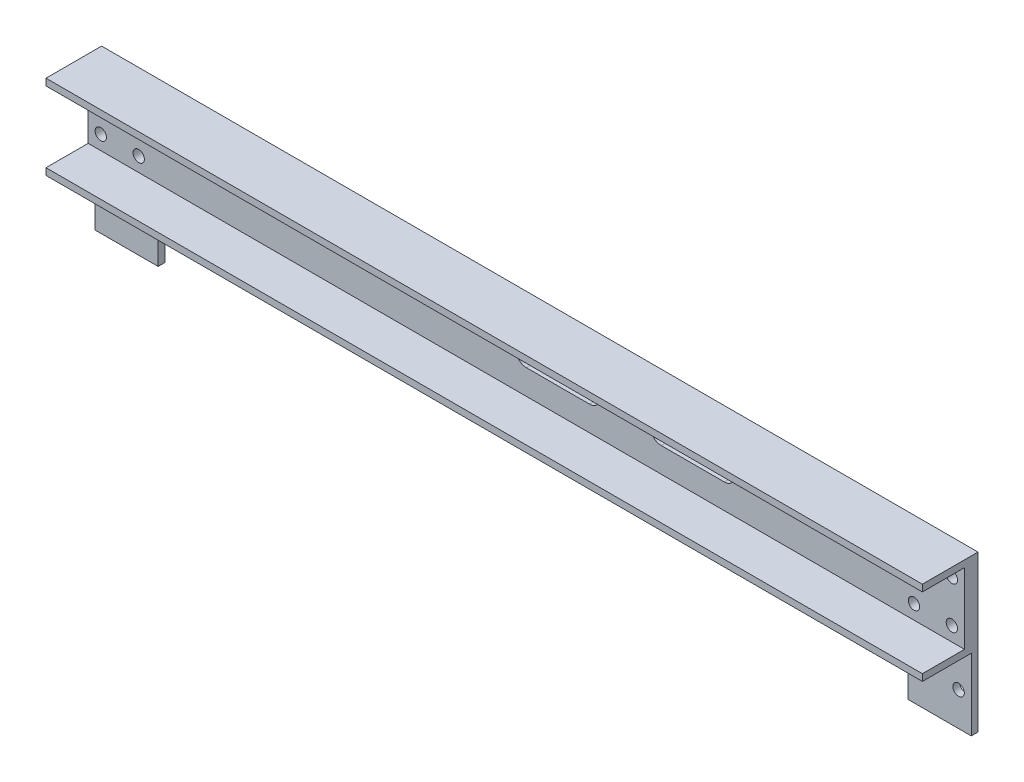
ISO-10303-21;
HEADER;
FILE_DESCRIPTION(('STEP AP214'),'2;1');
FILE_NAME('part.step','',(''),(''),'','','');
FILE_SCHEMA(('AUTOMOTIVE_DESIGN { 1 0 10303 214 1 1 1 1 }'));
ENDSEC;
DATA;
#1=APPLICATION_CONTEXT('core data for automotive mechanical design processes');
#2=APPLICATION_PROTOCOL_DEFINITION('international standard','automotive_design',2000,#1);
#3=PRODUCT_CONTEXT('',#1,'mechanical');
#4=PRODUCT('Part','Part','',(#3));
#5=PRODUCT_RELATED_PRODUCT_CATEGORY('part','',(#4));
#6=PRODUCT_DEFINITION_FORMATION('','',#4);
#7=PRODUCT_DEFINITION_CONTEXT('part definition',#1,'design');
#8=PRODUCT_DEFINITION('design','',#6,#7);
#9=PRODUCT_DEFINITION_SHAPE('','',#8);
#10=(LENGTH_UNIT() NAMED_UNIT(*) SI_UNIT(.MILLI.,.METRE.));
#11=(NAMED_UNIT(*) PLANE_ANGLE_UNIT() SI_UNIT($,.RADIAN.));
#12=(NAMED_UNIT(*) SI_UNIT($,.STERADIAN.) SOLID_ANGLE_UNIT());
#13=UNCERTAINTY_MEASURE_WITH_UNIT(LENGTH_MEASURE(1.E-05),#10,'distance_accuracy_value','');
#14=(GEOMETRIC_REPRESENTATION_CONTEXT(3) GLOBAL_UNCERTAINTY_ASSIGNED_CONTEXT((#13)) GLOBAL_UNIT_ASSIGNED_CONTEXT((#10,
#11,#12)) REPRESENTATION_CONTEXT('',''));
#15=CARTESIAN_POINT('',(0.,0.,0.));
#16=DIRECTION('',(0.,0.,1.));
#17=DIRECTION('',(1.,0.,0.));
#18=AXIS2_PLACEMENT_3D('',#15,#16,#17);
#19=CARTESIAN_POINT('',(0.,0.,16.));
#20=DIRECTION('',(0.,0.,-1.));
#21=DIRECTION('',(-1.,0.,0.));
#22=AXIS2_PLACEMENT_3D('',#19,#20,#21);
#23=PLANE('',#22);
#24=CARTESIAN_POINT('',(-505.,-25.,16.));
#25=DIRECTION('',(0.,0.,1.));
#26=DIRECTION('',(1.,0.,0.));
#27=AXIS2_PLACEMENT_3D('',#24,#25,#26);
#28=CIRCLE('',#27,6.74999999999998);
#29=CARTESIAN_POINT('',(-498.25,-25.,16.));
#30=VERTEX_POINT('',#29);
#31=EDGE_CURVE('E819',#30,#30,#28,.T.);
#32=ORIENTED_EDGE('',*,*,#31,.F.);
#33=EDGE_LOOP('',(#32));
#34=FACE_BOUND('',#33,.T.);
#35=CARTESIAN_POINT('',(-460.,-25.,16.));
#36=DIRECTION('',(0.,0.,1.));
#37=DIRECTION('',(1.,0.,0.));
#38=AXIS2_PLACEMENT_3D('',#35,#36,#37);
#39=CIRCLE('',#38,6.74999999999998);
#40=CARTESIAN_POINT('',(-453.25,-25.,16.));
#41=VERTEX_POINT('',#40);
#42=EDGE_CURVE('E827',#41,#41,#39,.T.);
#43=ORIENTED_EDGE('',*,*,#42,.F.);
#44=EDGE_LOOP('',(#43));
#45=FACE_BOUND('',#44,.T.);
#46=DIRECTION('',(-1.,0.,0.));
#47=VECTOR('',#46,1.);
#48=CARTESIAN_POINT('',(0.,-12.5,16.));
#49=LINE('',#48,#47);
#50=CARTESIAN_POINT('',(75.,-12.5,16.));
#51=VERTEX_POINT('',#50);
#52=CARTESIAN_POINT('',(0.,-12.5,16.));
#53=VERTEX_POINT('',#52);
#54=EDGE_CURVE('E421',#51,#53,#49,.T.);
#55=ORIENTED_EDGE('',*,*,#54,.T.);
#56=CARTESIAN_POINT('',(0.,0.,16.));
#57=DIRECTION('',(0.,0.,1.));
#58=DIRECTION('',(1.,0.,0.));
#59=AXIS2_PLACEMENT_3D('',#56,#57,#58);
#60=CIRCLE('',#59,12.5);
#61=CARTESIAN_POINT('',(0.,12.5,16.));
#62=VERTEX_POINT('',#61);
#63=EDGE_CURVE('E11',#53,#62,#60,.F.);
#64=ORIENTED_EDGE('',*,*,#63,.T.);
#65=DIRECTION('',(-1.,0.,0.));
#66=VECTOR('',#65,1.);
#67=CARTESIAN_POINT('',(0.,12.5,16.));
#68=LINE('',#67,#66);
#69=CARTESIAN_POINT('',(75.,12.5,16.));
#70=VERTEX_POINT('',#69);
#71=EDGE_CURVE('E48',#62,#70,#68,.F.);
#72=ORIENTED_EDGE('',*,*,#71,.T.);
#73=CARTESIAN_POINT('',(75.,0.,16.));
#74=DIRECTION('',(0.,0.,1.));
#75=DIRECTION('',(1.,0.,0.));
#76=AXIS2_PLACEMENT_3D('',#73,#74,#75);
#77=CIRCLE('',#76,12.5);
#78=EDGE_CURVE('E425',#70,#51,#77,.F.);
#79=ORIENTED_EDGE('',*,*,#78,.T.);
#80=EDGE_LOOP('',(#55,#64,#72,#79));
#81=FACE_BOUND('',#80,.T.);
#82=DIRECTION('',(-1.,0.,0.));
#83=VECTOR('',#82,1.);
#84=CARTESIAN_POINT('',(0.,-12.5,16.));
#85=LINE('',#84,#83);
#86=CARTESIAN_POINT('',(235.,-12.5,16.));
#87=VERTEX_POINT('',#86);
#88=CARTESIAN_POINT('',(160.,-12.5,16.));
#89=VERTEX_POINT('',#88);
#90=EDGE_CURVE('E405',#87,#89,#85,.T.);
#91=ORIENTED_EDGE('',*,*,#90,.T.);
#92=CARTESIAN_POINT('',(160.,0.,16.));
#93=DIRECTION('',(0.,0.,1.));
#94=DIRECTION('',(1.,0.,0.));
#95=AXIS2_PLACEMENT_3D('',#92,#93,#94);
#96=CIRCLE('',#95,12.5);
#97=CARTESIAN_POINT('',(160.,12.5,16.));
#98=VERTEX_POINT('',#97);
#99=EDGE_CURVE('E417',#89,#98,#96,.F.);
#100=ORIENTED_EDGE('',*,*,#99,.T.);
#101=DIRECTION('',(-1.,0.,0.));
#102=VECTOR('',#101,1.);
#103=CARTESIAN_POINT('',(0.,12.5,16.));
#104=LINE('',#103,#102);
#105=CARTESIAN_POINT('',(235.,12.5,16.));
#106=VERTEX_POINT('',#105);
#107=EDGE_CURVE('E413',#98,#106,#104,.F.);
#108=ORIENTED_EDGE('',*,*,#107,.T.);
#109=CARTESIAN_POINT('',(235.,0.,16.));
#110=DIRECTION('',(0.,0.,1.));
#111=DIRECTION('',(1.,0.,0.));
#112=AXIS2_PLACEMENT_3D('',#109,#110,#111);
#113=CIRCLE('',#112,12.5);
#114=EDGE_CURVE('E409',#106,#87,#113,.F.);
#115=ORIENTED_EDGE('',*,*,#114,.T.);
#116=EDGE_LOOP('',(#91,#100,#108,#115));
#117=FACE_BOUND('',#116,.T.);
#118=DIRECTION('',(1.,0.,0.));
#119=VECTOR('',#118,1.);
#120=CARTESIAN_POINT('',(520.,42.,16.));
#121=LINE('',#120,#119);
#122=CARTESIAN_POINT('',(-520.,42.,16.));
#123=VERTEX_POINT('',#122);
#124=CARTESIAN_POINT('',(520.,42.,16.));
#125=VERTEX_POINT('',#124);
#126=EDGE_CURVE('E55',#123,#125,#121,.T.);
#127=ORIENTED_EDGE('',*,*,#126,.F.);
#128=DIRECTION('',(0.,-1.,0.));
#129=VECTOR('',#128,1.);
#130=CARTESIAN_POINT('',(-520.,-50.,16.));
#131=LINE('',#130,#129);
#132=CARTESIAN_POINT('',(-520.,-42.,16.));
#133=VERTEX_POINT('',#132);
#134=EDGE_CURVE('E323',#123,#133,#131,.T.);
#135=ORIENTED_EDGE('',*,*,#134,.T.);
#136=DIRECTION('',(-1.,0.,0.));
#137=VECTOR('',#136,1.);
#138=CARTESIAN_POINT('',(-520.,-42.,16.));
#139=LINE('',#138,#137);
#140=CARTESIAN_POINT('',(520.,-42.,16.));
#141=VERTEX_POINT('',#140);
#142=EDGE_CURVE('E232',#141,#133,#139,.T.);
#143=ORIENTED_EDGE('',*,*,#142,.F.);
#144=DIRECTION('',(0.,1.,0.));
#145=VECTOR('',#144,1.);
#146=CARTESIAN_POINT('',(520.,-50.,16.));
#147=LINE('',#146,#145);
#148=EDGE_CURVE('E60',#141,#125,#147,.T.);
#149=ORIENTED_EDGE('',*,*,#148,.T.);
#150=EDGE_LOOP('',(#127,#135,#143,#149));
#151=FACE_BOUND('',#150,.T.);
#152=CARTESIAN_POINT('',(505.,25.,16.));
#153=DIRECTION('',(0.,0.,1.));
#154=DIRECTION('',(1.,0.,0.));
#155=AXIS2_PLACEMENT_3D('',#152,#153,#154);
#156=CIRCLE('',#155,6.75000000000003);
#157=CARTESIAN_POINT('',(511.75,25.,16.));
#158=VERTEX_POINT('',#157);
#159=EDGE_CURVE('E886',#158,#158,#156,.T.);
#160=ORIENTED_EDGE('',*,*,#159,.F.);
#161=EDGE_LOOP('',(#160));
#162=FACE_BOUND('',#161,.T.);
#163=CARTESIAN_POINT('',(460.,25.,16.));
#164=DIRECTION('',(0.,0.,1.));
#165=DIRECTION('',(1.,0.,0.));
#166=AXIS2_PLACEMENT_3D('',#163,#164,#165);
#167=CIRCLE('',#166,6.74999999999998);
#168=CARTESIAN_POINT('',(466.75,25.,16.));
#169=VERTEX_POINT('',#168);
#170=EDGE_CURVE('E879',#169,#169,#167,.T.);
#171=ORIENTED_EDGE('',*,*,#170,.F.);
#172=EDGE_LOOP('',(#171));
#173=FACE_BOUND('',#172,.T.);
#174=CARTESIAN_POINT('',(460.,-25.,16.));
#175=DIRECTION('',(0.,0.,1.));
#176=DIRECTION('',(1.,0.,0.));
#177=AXIS2_PLACEMENT_3D('',#174,#175,#176);
#178=CIRCLE('',#177,6.74999999999998);
#179=CARTESIAN_POINT('',(466.75,-25.,16.));
#180=VERTEX_POINT('',#179);
#181=EDGE_CURVE('E871',#180,#180,#178,.T.);
#182=ORIENTED_EDGE('',*,*,#181,.F.);
#183=EDGE_LOOP('',(#182));
#184=FACE_BOUND('',#183,.T.);
#185=CARTESIAN_POINT('',(505.,-25.,16.));
#186=DIRECTION('',(0.,0.,1.));
#187=DIRECTION('',(1.,0.,0.));
#188=AXIS2_PLACEMENT_3D('',#185,#186,#187);
#189=CIRCLE('',#188,6.75000000000003);
#190=CARTESIAN_POINT('',(511.75,-25.,16.));
#191=VERTEX_POINT('',#190);
#192=EDGE_CURVE('E863',#191,#191,#189,.T.);
#193=ORIENTED_EDGE('',*,*,#192,.F.);
#194=EDGE_LOOP('',(#193));
#195=FACE_BOUND('',#194,.T.);
#196=CARTESIAN_POINT('',(-505.,25.,16.));
#197=DIRECTION('',(0.,0.,1.));
#198=DIRECTION('',(1.,0.,0.));
#199=AXIS2_PLACEMENT_3D('',#196,#197,#198);
#200=CIRCLE('',#199,6.74999999999998);
#201=CARTESIAN_POINT('',(-498.25,25.,16.));
#202=VERTEX_POINT('',#201);
#203=EDGE_CURVE('E807',#202,#202,#200,.T.);
#204=ORIENTED_EDGE('',*,*,#203,.F.);
#205=EDGE_LOOP('',(#204));
#206=FACE_BOUND('',#205,.T.);
#207=CARTESIAN_POINT('',(-460.,25.,16.));
#208=DIRECTION('',(0.,0.,1.));
#209=DIRECTION('',(1.,0.,0.));
#210=AXIS2_PLACEMENT_3D('',#207,#208,#209);
#211=CIRCLE('',#210,6.74999999999998);
#212=CARTESIAN_POINT('',(-453.25,25.,16.));
#213=VERTEX_POINT('',#212);
#214=EDGE_CURVE('E802',#213,#213,#211,.T.);
#215=ORIENTED_EDGE('',*,*,#214,.F.);
#216=EDGE_LOOP('',(#215));
#217=FACE_BOUND('',#216,.T.);
#218=ADVANCED_FACE('F39',(#34,#45,#81,#117,#151,#162,#173,#184,#195,#206,#217),#23,.F.);
#219=CARTESIAN_POINT('',(0.,0.,8.));
#220=DIRECTION('',(0.,0.,-1.));
#221=DIRECTION('',(-1.,0.,0.));
#222=AXIS2_PLACEMENT_3D('',#219,#220,#221);
#223=PLANE('',#222);
#224=CARTESIAN_POINT('',(-460.,-95.,8.));
#225=DIRECTION('',(0.,0.,-1.));
#226=DIRECTION('',(-1.,0.,0.));
#227=AXIS2_PLACEMENT_3D('',#224,#225,#226);
#228=CIRCLE('',#227,6.74999999999998);
#229=CARTESIAN_POINT('',(-466.75,-95.,8.));
#230=VERTEX_POINT('',#229);
#231=EDGE_CURVE('E839',#230,#230,#228,.T.);
#232=ORIENTED_EDGE('',*,*,#231,.T.);
#233=EDGE_LOOP('',(#232));
#234=FACE_BOUND('',#233,.T.);
#235=CARTESIAN_POINT('',(-505.,-95.,8.));
#236=DIRECTION('',(0.,0.,-1.));
#237=DIRECTION('',(-1.,0.,0.));
#238=AXIS2_PLACEMENT_3D('',#235,#236,#237);
#239=CIRCLE('',#238,6.74999999999998);
#240=CARTESIAN_POINT('',(-511.75,-95.,8.));
#241=VERTEX_POINT('',#240);
#242=EDGE_CURVE('E847',#241,#241,#239,.T.);
#243=ORIENTED_EDGE('',*,*,#242,.T.);
#244=EDGE_LOOP('',(#243));
#245=FACE_BOUND('',#244,.T.);
#246=DIRECTION('',(1.,0.,0.));
#247=VECTOR('',#246,1.);
#248=CARTESIAN_POINT('',(-520.,-50.,8.));
#249=LINE('',#248,#247);
#250=CARTESIAN_POINT('',(-520.,-50.,8.));
#251=VERTEX_POINT('',#250);
#252=CARTESIAN_POINT('',(-445.,-50.,8.));
#253=VERTEX_POINT('',#252);
#254=EDGE_CURVE('E286',#251,#253,#249,.T.);
#255=ORIENTED_EDGE('',*,*,#254,.F.);
#256=DIRECTION('',(0.,-1.,0.));
#257=VECTOR('',#256,1.);
#258=CARTESIAN_POINT('',(-520.,-50.,8.));
#259=LINE('',#258,#257);
#260=CARTESIAN_POINT('',(-520.,-135.,8.));
#261=VERTEX_POINT('',#260);
#262=EDGE_CURVE('E341',#251,#261,#259,.T.);
#263=ORIENTED_EDGE('',*,*,#262,.T.);
#264=DIRECTION('',(1.,0.,0.));
#265=VECTOR('',#264,1.);
#266=CARTESIAN_POINT('',(-520.,-135.,8.));
#267=LINE('',#266,#265);
#268=CARTESIAN_POINT('',(-445.,-135.,8.));
#269=VERTEX_POINT('',#268);
#270=EDGE_CURVE('E345',#261,#269,#267,.T.);
#271=ORIENTED_EDGE('',*,*,#270,.T.);
#272=DIRECTION('',(0.,1.,0.));
#273=VECTOR('',#272,1.);
#274=CARTESIAN_POINT('',(-445.,-50.,8.));
#275=LINE('',#274,#273);
#276=EDGE_CURVE('E348',#269,#253,#275,.T.);
#277=ORIENTED_EDGE('',*,*,#276,.T.);
#278=EDGE_LOOP('',(#255,#263,#271,#277));
#279=FACE_BOUND('',#278,.T.);
#280=ADVANCED_FACE('F461',(#234,#245,#279),#223,.F.);
#281=CARTESIAN_POINT('',(460.,-95.,8.));
#282=DIRECTION('',(0.,0.,-1.));
#283=DIRECTION('',(-1.,0.,0.));
#284=AXIS2_PLACEMENT_3D('',#281,#282,#283);
#285=CIRCLE('',#284,6.74999999999998);
#286=CARTESIAN_POINT('',(453.25,-95.,8.));
#287=VERTEX_POINT('',#286);
#288=EDGE_CURVE('E515',#287,#287,#285,.T.);
#289=ORIENTED_EDGE('',*,*,#288,.T.);
#290=EDGE_LOOP('',(#289));
#291=FACE_BOUND('',#290,.T.);
#292=CARTESIAN_POINT('',(505.,-95.,8.));
#293=DIRECTION('',(0.,0.,-1.));
#294=DIRECTION('',(-1.,0.,0.));
#295=AXIS2_PLACEMENT_3D('',#292,#293,#294);
#296=CIRCLE('',#295,6.75000000000003);
#297=CARTESIAN_POINT('',(498.25,-95.,8.));
#298=VERTEX_POINT('',#297);
#299=EDGE_CURVE('E519',#298,#298,#296,.T.);
#300=ORIENTED_EDGE('',*,*,#299,.T.);
#301=EDGE_LOOP('',(#300));
#302=FACE_BOUND('',#301,.T.);
#303=CARTESIAN_POINT('',(445.,-50.,8.));
#304=VERTEX_POINT('',#303);
#305=CARTESIAN_POINT('',(520.,-50.,8.));
#306=VERTEX_POINT('',#305);
#307=EDGE_CURVE('E330',#304,#306,#249,.T.);
#308=ORIENTED_EDGE('',*,*,#307,.F.);
#309=DIRECTION('',(0.,-1.,0.));
#310=VECTOR('',#309,1.);
#311=CARTESIAN_POINT('',(445.,-50.,8.));
#312=LINE('',#311,#310);
#313=CARTESIAN_POINT('',(445.,-135.,8.));
#314=VERTEX_POINT('',#313);
#315=EDGE_CURVE('E351',#304,#314,#312,.T.);
#316=ORIENTED_EDGE('',*,*,#315,.T.);
#317=DIRECTION('',(1.,0.,0.));
#318=VECTOR('',#317,1.);
#319=CARTESIAN_POINT('',(520.,-135.,8.));
#320=LINE('',#319,#318);
#321=CARTESIAN_POINT('',(520.,-135.,8.));
#322=VERTEX_POINT('',#321);
#323=EDGE_CURVE('E354',#314,#322,#320,.T.);
#324=ORIENTED_EDGE('',*,*,#323,.T.);
#325=DIRECTION('',(0.,1.,0.));
#326=VECTOR('',#325,1.);
#327=CARTESIAN_POINT('',(520.,-50.,8.));
#328=LINE('',#327,#326);
#329=EDGE_CURVE('E338',#322,#306,#328,.T.);
#330=ORIENTED_EDGE('',*,*,#329,.T.);
#331=EDGE_LOOP('',(#308,#316,#324,#330));
#332=FACE_BOUND('',#331,.T.);
#333=ADVANCED_FACE('F467',(#291,#302,#332),#223,.F.);
#334=CARTESIAN_POINT('',(-520.,50.,8.));
#335=DIRECTION('',(0.,-1.,0.));
#336=DIRECTION('',(0.,0.,-1.));
#337=AXIS2_PLACEMENT_3D('',#334,#335,#336);
#338=PLANE('',#337);
#339=DIRECTION('',(-1.,0.,0.));
#340=VECTOR('',#339,1.);
#341=CARTESIAN_POINT('',(-520.,50.,0.));
#342=LINE('',#341,#340);
#343=CARTESIAN_POINT('',(520.,50.,0.));
#344=VERTEX_POINT('',#343);
#345=CARTESIAN_POINT('',(-520.,50.,0.));
#346=VERTEX_POINT('',#345);
#347=EDGE_CURVE('E194',#344,#346,#342,.T.);
#348=ORIENTED_EDGE('',*,*,#347,.T.);
#349=DIRECTION('',(0.,0.,-1.));
#350=VECTOR('',#349,1.);
#351=CARTESIAN_POINT('',(-520.,50.,8.));
#352=LINE('',#351,#350);
#353=CARTESIAN_POINT('',(-520.,50.,66.));
#354=VERTEX_POINT('',#353);
#355=EDGE_CURVE('E188',#354,#346,#352,.T.);
#356=ORIENTED_EDGE('',*,*,#355,.F.);
#357=DIRECTION('',(-1.,0.,0.));
#358=VECTOR('',#357,1.);
#359=CARTESIAN_POINT('',(520.,50.,66.));
#360=LINE('',#359,#358);
#361=CARTESIAN_POINT('',(520.,50.,66.));
#362=VERTEX_POINT('',#361);
#363=EDGE_CURVE('E192',#362,#354,#360,.T.);
#364=ORIENTED_EDGE('',*,*,#363,.F.);
#365=DIRECTION('',(0.,0.,-1.));
#366=VECTOR('',#365,1.);
#367=CARTESIAN_POINT('',(520.,50.,8.));
#368=LINE('',#367,#366);
#369=EDGE_CURVE('E197',#362,#344,#368,.T.);
#370=ORIENTED_EDGE('',*,*,#369,.T.);
#371=EDGE_LOOP('',(#348,#356,#364,#370));
#372=FACE_BOUND('',#371,.T.);
#373=ADVANCED_FACE('F41',(#372),#338,.F.);
#374=CARTESIAN_POINT('',(-520.,-50.,8.));
#375=DIRECTION('',(1.,0.,0.));
#376=DIRECTION('',(0.,0.,-1.));
#377=AXIS2_PLACEMENT_3D('',#374,#375,#376);
#378=PLANE('',#377);
#379=DIRECTION('',(0.,-1.,0.));
#380=VECTOR('',#379,1.);
#381=CARTESIAN_POINT('',(-520.,-50.,0.));
#382=LINE('',#381,#380);
#383=CARTESIAN_POINT('',(-520.,-135.,0.));
#384=VERTEX_POINT('',#383);
#385=EDGE_CURVE('E361',#346,#384,#382,.T.);
#386=ORIENTED_EDGE('',*,*,#385,.T.);
#387=DIRECTION('',(0.,0.,-1.));
#388=VECTOR('',#387,1.);
#389=CARTESIAN_POINT('',(-520.,-135.,8.));
#390=LINE('',#389,#388);
#391=EDGE_CURVE('E198',#261,#384,#390,.T.);
#392=ORIENTED_EDGE('',*,*,#391,.F.);
#393=ORIENTED_EDGE('',*,*,#262,.F.);
#394=DIRECTION('',(0.,0.,-1.));
#395=VECTOR('',#394,1.);
#396=CARTESIAN_POINT('',(-520.,-50.,16.));
#397=LINE('',#396,#395);
#398=CARTESIAN_POINT('',(-520.,-50.,66.));
#399=VERTEX_POINT('',#398);
#400=EDGE_CURVE('E334',#399,#251,#397,.T.);
#401=ORIENTED_EDGE('',*,*,#400,.F.);
#402=DIRECTION('',(0.,-1.,0.));
#403=VECTOR('',#402,1.);
#404=CARTESIAN_POINT('',(-520.,-42.,66.));
#405=LINE('',#404,#403);
#406=CARTESIAN_POINT('',(-520.,-42.,66.));
#407=VERTEX_POINT('',#406);
#408=EDGE_CURVE('E243',#407,#399,#405,.T.);
#409=ORIENTED_EDGE('',*,*,#408,.F.);
#410=DIRECTION('',(0.,0.,-1.));
#411=VECTOR('',#410,1.);
#412=CARTESIAN_POINT('',(-520.,-42.,66.));
#413=LINE('',#412,#411);
#414=EDGE_CURVE('E247',#407,#133,#413,.T.);
#415=ORIENTED_EDGE('',*,*,#414,.T.);
#416=ORIENTED_EDGE('',*,*,#134,.F.);
#417=DIRECTION('',(0.,0.,-1.));
#418=VECTOR('',#417,1.);
#419=CARTESIAN_POINT('',(-520.,42.,66.));
#420=LINE('',#419,#418);
#421=CARTESIAN_POINT('',(-520.,42.,66.));
#422=VERTEX_POINT('',#421);
#423=EDGE_CURVE('E204',#422,#123,#420,.T.);
#424=ORIENTED_EDGE('',*,*,#423,.F.);
#425=DIRECTION('',(0.,-1.,0.));
#426=VECTOR('',#425,1.);
#427=CARTESIAN_POINT('',(-520.,50.,66.));
#428=LINE('',#427,#426);
#429=EDGE_CURVE('E201',#354,#422,#428,.T.);
#430=ORIENTED_EDGE('',*,*,#429,.F.);
#431=ORIENTED_EDGE('',*,*,#355,.T.);
#432=EDGE_LOOP('',(#386,#392,#393,#401,#409,#415,#416,#424,#430,#431));
#433=FACE_BOUND('',#432,.T.);
#434=ADVANCED_FACE('F202',(#433),#378,.F.);
#435=CARTESIAN_POINT('',(-520.,-135.,8.));
#436=DIRECTION('',(0.,1.,0.));
#437=DIRECTION('',(0.,0.,1.));
#438=AXIS2_PLACEMENT_3D('',#435,#436,#437);
#439=PLANE('',#438);
#440=DIRECTION('',(1.,0.,0.));
#441=VECTOR('',#440,1.);
#442=CARTESIAN_POINT('',(-520.,-135.,0.));
#443=LINE('',#442,#441);
#444=CARTESIAN_POINT('',(-445.,-135.,0.));
#445=VERTEX_POINT('',#444);
#446=EDGE_CURVE('E364',#384,#445,#443,.T.);
#447=ORIENTED_EDGE('',*,*,#446,.T.);
#448=DIRECTION('',(0.,0.,-1.));
#449=VECTOR('',#448,1.);
#450=CARTESIAN_POINT('',(-445.,-135.,8.));
#451=LINE('',#450,#449);
#452=EDGE_CURVE('E396',#269,#445,#451,.T.);
#453=ORIENTED_EDGE('',*,*,#452,.F.);
#454=ORIENTED_EDGE('',*,*,#270,.F.);
#455=ORIENTED_EDGE('',*,*,#391,.T.);
#456=EDGE_LOOP('',(#447,#453,#454,#455));
#457=FACE_BOUND('',#456,.T.);
#458=ADVANCED_FACE('F498',(#457),#439,.F.);
#459=CARTESIAN_POINT('',(-445.,-50.,8.));
#460=DIRECTION('',(-1.,0.,0.));
#461=DIRECTION('',(0.,0.,1.));
#462=AXIS2_PLACEMENT_3D('',#459,#460,#461);
#463=PLANE('',#462);
#464=DIRECTION('',(0.,1.,0.));
#465=VECTOR('',#464,1.);
#466=CARTESIAN_POINT('',(-445.,-50.,0.));
#467=LINE('',#466,#465);
#468=CARTESIAN_POINT('',(-445.,-50.,0.));
#469=VERTEX_POINT('',#468);
#470=EDGE_CURVE('E367',#445,#469,#467,.T.);
#471=ORIENTED_EDGE('',*,*,#470,.T.);
#472=DIRECTION('',(0.,0.,-1.));
#473=VECTOR('',#472,1.);
#474=CARTESIAN_POINT('',(-445.,-50.,8.));
#475=LINE('',#474,#473);
#476=EDGE_CURVE('E392',#253,#469,#475,.T.);
#477=ORIENTED_EDGE('',*,*,#476,.F.);
#478=ORIENTED_EDGE('',*,*,#276,.F.);
#479=ORIENTED_EDGE('',*,*,#452,.T.);
#480=EDGE_LOOP('',(#471,#477,#478,#479));
#481=FACE_BOUND('',#480,.T.);
#482=ADVANCED_FACE('F494',(#481),#463,.F.);
#483=CARTESIAN_POINT('',(-445.,-50.,8.));
#484=DIRECTION('',(0.,1.,0.));
#485=DIRECTION('',(-1.,0.,0.));
#486=AXIS2_PLACEMENT_3D('',#483,#484,#485);
#487=PLANE('',#486);
#488=DIRECTION('',(1.,0.,0.));
#489=VECTOR('',#488,1.);
#490=CARTESIAN_POINT('',(-445.,-50.,0.));
#491=LINE('',#490,#489);
#492=CARTESIAN_POINT('',(445.,-50.,0.));
#493=VERTEX_POINT('',#492);
#494=EDGE_CURVE('E370',#469,#493,#491,.T.);
#495=ORIENTED_EDGE('',*,*,#494,.T.);
#496=DIRECTION('',(0.,0.,-1.));
#497=VECTOR('',#496,1.);
#498=CARTESIAN_POINT('',(445.,-50.,8.));
#499=LINE('',#498,#497);
#500=EDGE_CURVE('E388',#304,#493,#499,.T.);
#501=ORIENTED_EDGE('',*,*,#500,.F.);
#502=ORIENTED_EDGE('',*,*,#307,.T.);
#503=DIRECTION('',(0.,0.,-1.));
#504=VECTOR('',#503,1.);
#505=CARTESIAN_POINT('',(520.,-50.,16.));
#506=LINE('',#505,#504);
#507=CARTESIAN_POINT('',(520.,-50.,66.));
#508=VERTEX_POINT('',#507);
#509=EDGE_CURVE('E326',#508,#306,#506,.T.);
#510=ORIENTED_EDGE('',*,*,#509,.F.);
#511=DIRECTION('',(1.,0.,0.));
#512=VECTOR('',#511,1.);
#513=CARTESIAN_POINT('',(-520.,-50.,66.));
#514=LINE('',#513,#512);
#515=EDGE_CURVE('E233',#399,#508,#514,.T.);
#516=ORIENTED_EDGE('',*,*,#515,.F.);
#517=ORIENTED_EDGE('',*,*,#400,.T.);
#518=ORIENTED_EDGE('',*,*,#254,.T.);
#519=ORIENTED_EDGE('',*,*,#476,.T.);
#520=EDGE_LOOP('',(#495,#501,#502,#510,#516,#517,#518,#519));
#521=FACE_BOUND('',#520,.T.);
#522=ADVANCED_FACE('F490',(#521),#487,.F.);
#523=CARTESIAN_POINT('',(445.,-50.,8.));
#524=DIRECTION('',(1.,0.,0.));
#525=DIRECTION('',(0.,0.,-1.));
#526=AXIS2_PLACEMENT_3D('',#523,#524,#525);
#527=PLANE('',#526);
#528=DIRECTION('',(0.,-1.,0.));
#529=VECTOR('',#528,1.);
#530=CARTESIAN_POINT('',(445.,-50.,0.));
#531=LINE('',#530,#529);
#532=CARTESIAN_POINT('',(445.,-135.,0.));
#533=VERTEX_POINT('',#532);
#534=EDGE_CURVE('E373',#493,#533,#531,.T.);
#535=ORIENTED_EDGE('',*,*,#534,.T.);
#536=DIRECTION('',(0.,0.,-1.));
#537=VECTOR('',#536,1.);
#538=CARTESIAN_POINT('',(445.,-135.,8.));
#539=LINE('',#538,#537);
#540=EDGE_CURVE('E384',#314,#533,#539,.T.);
#541=ORIENTED_EDGE('',*,*,#540,.F.);
#542=ORIENTED_EDGE('',*,*,#315,.F.);
#543=ORIENTED_EDGE('',*,*,#500,.T.);
#544=EDGE_LOOP('',(#535,#541,#542,#543));
#545=FACE_BOUND('',#544,.T.);
#546=ADVANCED_FACE('F486',(#545),#527,.F.);
#547=CARTESIAN_POINT('',(520.,-135.,8.));
#548=DIRECTION('',(0.,1.,0.));
#549=DIRECTION('',(-1.,0.,0.));
#550=AXIS2_PLACEMENT_3D('',#547,#548,#549);
#551=PLANE('',#550);
#552=DIRECTION('',(1.,0.,0.));
#553=VECTOR('',#552,1.);
#554=CARTESIAN_POINT('',(520.,-135.,0.));
#555=LINE('',#554,#553);
#556=CARTESIAN_POINT('',(520.,-135.,0.));
#557=VERTEX_POINT('',#556);
#558=EDGE_CURVE('E376',#533,#557,#555,.T.);
#559=ORIENTED_EDGE('',*,*,#558,.T.);
#560=DIRECTION('',(0.,0.,-1.));
#561=VECTOR('',#560,1.);
#562=CARTESIAN_POINT('',(520.,-135.,8.));
#563=LINE('',#562,#561);
#564=EDGE_CURVE('E358',#322,#557,#563,.T.);
#565=ORIENTED_EDGE('',*,*,#564,.F.);
#566=ORIENTED_EDGE('',*,*,#323,.F.);
#567=ORIENTED_EDGE('',*,*,#540,.T.);
#568=EDGE_LOOP('',(#559,#565,#566,#567));
#569=FACE_BOUND('',#568,.T.);
#570=ADVANCED_FACE('F482',(#569),#551,.F.);
#571=CARTESIAN_POINT('',(520.,-50.,8.));
#572=DIRECTION('',(-1.,0.,0.));
#573=DIRECTION('',(0.,0.,1.));
#574=AXIS2_PLACEMENT_3D('',#571,#572,#573);
#575=PLANE('',#574);
#576=DIRECTION('',(0.,1.,0.));
#577=VECTOR('',#576,1.);
#578=CARTESIAN_POINT('',(520.,-50.,0.));
#579=LINE('',#578,#577);
#580=EDGE_CURVE('E342',#557,#344,#579,.T.);
#581=ORIENTED_EDGE('',*,*,#580,.T.);
#582=ORIENTED_EDGE('',*,*,#369,.F.);
#583=DIRECTION('',(0.,1.,0.));
#584=VECTOR('',#583,1.);
#585=CARTESIAN_POINT('',(520.,42.,66.));
#586=LINE('',#585,#584);
#587=CARTESIAN_POINT('',(520.,42.,66.));
#588=VERTEX_POINT('',#587);
#589=EDGE_CURVE('E213',#588,#362,#586,.T.);
#590=ORIENTED_EDGE('',*,*,#589,.F.);
#591=DIRECTION('',(0.,0.,-1.));
#592=VECTOR('',#591,1.);
#593=CARTESIAN_POINT('',(520.,42.,66.));
#594=LINE('',#593,#592);
#595=EDGE_CURVE('E225',#588,#125,#594,.T.);
#596=ORIENTED_EDGE('',*,*,#595,.T.);
#597=ORIENTED_EDGE('',*,*,#148,.F.);
#598=DIRECTION('',(0.,0.,-1.));
#599=VECTOR('',#598,1.);
#600=CARTESIAN_POINT('',(520.,-42.,66.));
#601=LINE('',#600,#599);
#602=CARTESIAN_POINT('',(520.,-42.,66.));
#603=VERTEX_POINT('',#602);
#604=EDGE_CURVE('E254',#603,#141,#601,.T.);
#605=ORIENTED_EDGE('',*,*,#604,.F.);
#606=DIRECTION('',(0.,1.,0.));
#607=VECTOR('',#606,1.);
#608=CARTESIAN_POINT('',(520.,-50.,66.));
#609=LINE('',#608,#607);
#610=EDGE_CURVE('E237',#508,#603,#609,.T.);
#611=ORIENTED_EDGE('',*,*,#610,.F.);
#612=ORIENTED_EDGE('',*,*,#509,.T.);
#613=ORIENTED_EDGE('',*,*,#329,.F.);
#614=ORIENTED_EDGE('',*,*,#564,.T.);
#615=EDGE_LOOP('',(#581,#582,#590,#596,#597,#605,#611,#612,#613,#614));
#616=FACE_BOUND('',#615,.T.);
#617=ADVANCED_FACE('F478',(#616),#575,.F.);
#618=CARTESIAN_POINT('',(0.,0.,0.));
#619=DIRECTION('',(0.,0.,-1.));
#620=DIRECTION('',(-1.,0.,0.));
#621=AXIS2_PLACEMENT_3D('',#618,#619,#620);
#622=PLANE('',#621);
#623=CARTESIAN_POINT('',(-460.,25.,0.));
#624=DIRECTION('',(0.,0.,-1.));
#625=DIRECTION('',(-1.,0.,0.));
#626=AXIS2_PLACEMENT_3D('',#623,#624,#625);
#627=CIRCLE('',#626,6.74999999999998);
#628=CARTESIAN_POINT('',(-466.75,25.,0.));
#629=VERTEX_POINT('',#628);
#630=EDGE_CURVE('E805',#629,#629,#627,.T.);
#631=ORIENTED_EDGE('',*,*,#630,.F.);
#632=EDGE_LOOP('',(#631));
#633=FACE_BOUND('',#632,.T.);
#634=CARTESIAN_POINT('',(-505.,25.,0.));
#635=DIRECTION('',(0.,0.,-1.));
#636=DIRECTION('',(-1.,0.,0.));
#637=AXIS2_PLACEMENT_3D('',#634,#635,#636);
#638=CIRCLE('',#637,6.74999999999998);
#639=CARTESIAN_POINT('',(-511.75,25.,0.));
#640=VERTEX_POINT('',#639);
#641=EDGE_CURVE('E812',#640,#640,#638,.T.);
#642=ORIENTED_EDGE('',*,*,#641,.F.);
#643=EDGE_LOOP('',(#642));
#644=FACE_BOUND('',#643,.T.);
#645=CARTESIAN_POINT('',(-505.,-25.,0.));
#646=DIRECTION('',(0.,0.,-1.));
#647=DIRECTION('',(-1.,0.,0.));
#648=AXIS2_PLACEMENT_3D('',#645,#646,#647);
#649=CIRCLE('',#648,6.74999999999998);
#650=CARTESIAN_POINT('',(-511.75,-25.,0.));
#651=VERTEX_POINT('',#650);
#652=EDGE_CURVE('E823',#651,#651,#649,.T.);
#653=ORIENTED_EDGE('',*,*,#652,.F.);
#654=EDGE_LOOP('',(#653));
#655=FACE_BOUND('',#654,.T.);
#656=CARTESIAN_POINT('',(-460.,-25.,0.));
#657=DIRECTION('',(0.,0.,-1.));
#658=DIRECTION('',(-1.,0.,0.));
#659=AXIS2_PLACEMENT_3D('',#656,#657,#658);
#660=CIRCLE('',#659,6.74999999999998);
#661=CARTESIAN_POINT('',(-466.75,-25.,0.));
#662=VERTEX_POINT('',#661);
#663=EDGE_CURVE('E831',#662,#662,#660,.T.);
#664=ORIENTED_EDGE('',*,*,#663,.F.);
#665=EDGE_LOOP('',(#664));
#666=FACE_BOUND('',#665,.T.);
#667=CARTESIAN_POINT('',(-460.,-95.,0.));
#668=DIRECTION('',(0.,0.,-1.));
#669=DIRECTION('',(-1.,0.,0.));
#670=AXIS2_PLACEMENT_3D('',#667,#668,#669);
#671=CIRCLE('',#670,6.74999999999998);
#672=CARTESIAN_POINT('',(-466.75,-95.,0.));
#673=VERTEX_POINT('',#672);
#674=EDGE_CURVE('E835',#673,#673,#671,.T.);
#675=ORIENTED_EDGE('',*,*,#674,.F.);
#676=EDGE_LOOP('',(#675));
#677=FACE_BOUND('',#676,.T.);
#678=CARTESIAN_POINT('',(-505.,-95.,0.));
#679=DIRECTION('',(0.,0.,-1.));
#680=DIRECTION('',(-1.,0.,0.));
#681=AXIS2_PLACEMENT_3D('',#678,#679,#680);
#682=CIRCLE('',#681,6.74999999999998);
#683=CARTESIAN_POINT('',(-511.75,-95.,0.));
#684=VERTEX_POINT('',#683);
#685=EDGE_CURVE('E843',#684,#684,#682,.T.);
#686=ORIENTED_EDGE('',*,*,#685,.F.);
#687=EDGE_LOOP('',(#686));
#688=FACE_BOUND('',#687,.T.);
#689=CARTESIAN_POINT('',(460.,-95.,0.));
#690=DIRECTION('',(0.,0.,-1.));
#691=DIRECTION('',(-1.,0.,0.));
#692=AXIS2_PLACEMENT_3D('',#689,#690,#691);
#693=CIRCLE('',#692,6.74999999999998);
#694=CARTESIAN_POINT('',(453.25,-95.,0.));
#695=VERTEX_POINT('',#694);
#696=EDGE_CURVE('E851',#695,#695,#693,.T.);
#697=ORIENTED_EDGE('',*,*,#696,.F.);
#698=EDGE_LOOP('',(#697));
#699=FACE_BOUND('',#698,.T.);
#700=CARTESIAN_POINT('',(505.,-95.,0.));
#701=DIRECTION('',(0.,0.,-1.));
#702=DIRECTION('',(-1.,0.,0.));
#703=AXIS2_PLACEMENT_3D('',#700,#701,#702);
#704=CIRCLE('',#703,6.75000000000003);
#705=CARTESIAN_POINT('',(498.25,-95.,0.));
#706=VERTEX_POINT('',#705);
#707=EDGE_CURVE('E857',#706,#706,#704,.T.);
#708=ORIENTED_EDGE('',*,*,#707,.F.);
#709=EDGE_LOOP('',(#708));
#710=FACE_BOUND('',#709,.T.);
#711=CARTESIAN_POINT('',(505.,-25.,0.));
#712=DIRECTION('',(0.,0.,-1.));
#713=DIRECTION('',(-1.,0.,0.));
#714=AXIS2_PLACEMENT_3D('',#711,#712,#713);
#715=CIRCLE('',#714,6.75000000000003);
#716=CARTESIAN_POINT('',(498.25,-25.,0.));
#717=VERTEX_POINT('',#716);
#718=EDGE_CURVE('E867',#717,#717,#715,.T.);
#719=ORIENTED_EDGE('',*,*,#718,.F.);
#720=EDGE_LOOP('',(#719));
#721=FACE_BOUND('',#720,.T.);
#722=CARTESIAN_POINT('',(460.,-25.,0.));
#723=DIRECTION('',(0.,0.,-1.));
#724=DIRECTION('',(-1.,0.,0.));
#725=AXIS2_PLACEMENT_3D('',#722,#723,#724);
#726=CIRCLE('',#725,6.74999999999998);
#727=CARTESIAN_POINT('',(453.25,-25.,0.));
#728=VERTEX_POINT('',#727);
#729=EDGE_CURVE('E875',#728,#728,#726,.T.);
#730=ORIENTED_EDGE('',*,*,#729,.F.);
#731=EDGE_LOOP('',(#730));
#732=FACE_BOUND('',#731,.T.);
#733=CARTESIAN_POINT('',(460.,25.,0.));
#734=DIRECTION('',(0.,0.,-1.));
#735=DIRECTION('',(-1.,0.,0.));
#736=AXIS2_PLACEMENT_3D('',#733,#734,#735);
#737=CIRCLE('',#736,6.74999999999998);
#738=CARTESIAN_POINT('',(453.25,25.,0.));
#739=VERTEX_POINT('',#738);
#740=EDGE_CURVE('E883',#739,#739,#737,.T.);
#741=ORIENTED_EDGE('',*,*,#740,.F.);
#742=EDGE_LOOP('',(#741));
#743=FACE_BOUND('',#742,.T.);
#744=CARTESIAN_POINT('',(505.,25.,0.));
#745=DIRECTION('',(0.,0.,-1.));
#746=DIRECTION('',(-1.,0.,0.));
#747=AXIS2_PLACEMENT_3D('',#744,#745,#746);
#748=CIRCLE('',#747,6.75000000000003);
#749=CARTESIAN_POINT('',(498.25,25.,0.));
#750=VERTEX_POINT('',#749);
#751=EDGE_CURVE('E217',#750,#750,#748,.T.);
#752=ORIENTED_EDGE('',*,*,#751,.F.);
#753=EDGE_LOOP('',(#752));
#754=FACE_BOUND('',#753,.T.);
#755=CARTESIAN_POINT('',(0.,0.,0.));
#756=DIRECTION('',(0.,0.,1.));
#757=DIRECTION('',(1.,0.,0.));
#758=AXIS2_PLACEMENT_3D('',#755,#756,#757);
#759=CIRCLE('',#758,12.5);
#760=CARTESIAN_POINT('',(0.,12.5,0.));
#761=VERTEX_POINT('',#760);
#762=CARTESIAN_POINT('',(0.,-12.5,0.));
#763=VERTEX_POINT('',#762);
#764=EDGE_CURVE('E259',#761,#763,#759,.T.);
#765=ORIENTED_EDGE('',*,*,#764,.T.);
#766=DIRECTION('',(1.,0.,0.));
#767=VECTOR('',#766,1.);
#768=CARTESIAN_POINT('',(0.,-12.5,0.));
#769=LINE('',#768,#767);
#770=CARTESIAN_POINT('',(75.,-12.5,0.));
#771=VERTEX_POINT('',#770);
#772=EDGE_CURVE('E263',#763,#771,#769,.T.);
#773=ORIENTED_EDGE('',*,*,#772,.T.);
#774=CARTESIAN_POINT('',(75.,0.,0.));
#775=DIRECTION('',(0.,0.,1.));
#776=DIRECTION('',(1.,0.,0.));
#777=AXIS2_PLACEMENT_3D('',#774,#775,#776);
#778=CIRCLE('',#777,12.5);
#779=CARTESIAN_POINT('',(75.,12.5,0.));
#780=VERTEX_POINT('',#779);
#781=EDGE_CURVE('E268',#771,#780,#778,.T.);
#782=ORIENTED_EDGE('',*,*,#781,.T.);
#783=DIRECTION('',(-1.,0.,0.));
#784=VECTOR('',#783,1.);
#785=CARTESIAN_POINT('',(0.,12.5,0.));
#786=LINE('',#785,#784);
#787=EDGE_CURVE('E272',#780,#761,#786,.T.);
#788=ORIENTED_EDGE('',*,*,#787,.T.);
#789=EDGE_LOOP('',(#765,#773,#782,#788));
#790=FACE_BOUND('',#789,.T.);
#791=CARTESIAN_POINT('',(160.,0.,0.));
#792=DIRECTION('',(0.,0.,1.));
#793=DIRECTION('',(1.,0.,0.));
#794=AXIS2_PLACEMENT_3D('',#791,#792,#793);
#795=CIRCLE('',#794,12.5);
#796=CARTESIAN_POINT('',(160.,12.5,0.));
#797=VERTEX_POINT('',#796);
#798=CARTESIAN_POINT('',(160.,-12.5,0.));
#799=VERTEX_POINT('',#798);
#800=EDGE_CURVE('E258',#797,#799,#795,.T.);
#801=ORIENTED_EDGE('',*,*,#800,.T.);
#802=DIRECTION('',(1.,0.,0.));
#803=VECTOR('',#802,1.);
#804=CARTESIAN_POINT('',(160.,-12.5,0.));
#805=LINE('',#804,#803);
#806=CARTESIAN_POINT('',(235.,-12.5,0.));
#807=VERTEX_POINT('',#806);
#808=EDGE_CURVE('E295',#799,#807,#805,.T.);
#809=ORIENTED_EDGE('',*,*,#808,.T.);
#810=CARTESIAN_POINT('',(235.,0.,0.));
#811=DIRECTION('',(0.,0.,1.));
#812=DIRECTION('',(1.,0.,0.));
#813=AXIS2_PLACEMENT_3D('',#810,#811,#812);
#814=CIRCLE('',#813,12.5);
#815=CARTESIAN_POINT('',(235.,12.5,0.));
#816=VERTEX_POINT('',#815);
#817=EDGE_CURVE('E299',#807,#816,#814,.T.);
#818=ORIENTED_EDGE('',*,*,#817,.T.);
#819=DIRECTION('',(-1.,0.,0.));
#820=VECTOR('',#819,1.);
#821=CARTESIAN_POINT('',(160.,12.5,0.));
#822=LINE('',#821,#820);
#823=EDGE_CURVE('E303',#816,#797,#822,.T.);
#824=ORIENTED_EDGE('',*,*,#823,.T.);
#825=EDGE_LOOP('',(#801,#809,#818,#824));
#826=FACE_BOUND('',#825,.T.);
#827=ORIENTED_EDGE('',*,*,#347,.F.);
#828=ORIENTED_EDGE('',*,*,#580,.F.);
#829=ORIENTED_EDGE('',*,*,#558,.F.);
#830=ORIENTED_EDGE('',*,*,#534,.F.);
#831=ORIENTED_EDGE('',*,*,#494,.F.);
#832=ORIENTED_EDGE('',*,*,#470,.F.);
#833=ORIENTED_EDGE('',*,*,#446,.F.);
#834=ORIENTED_EDGE('',*,*,#385,.F.);
#835=EDGE_LOOP('',(#827,#828,#829,#830,#831,#832,#833,#834));
#836=FACE_BOUND('',#835,.T.);
#837=ADVANCED_FACE('F441',(#633,#644,#655,#666,#677,#688,#699,#710,#721,#732,#743,#754,#790,
#826,#836),#622,.T.);
#838=CARTESIAN_POINT('',(160.,0.,0.));
#839=DIRECTION('',(0.,0.,1.));
#840=DIRECTION('',(1.,0.,0.));
#841=AXIS2_PLACEMENT_3D('',#838,#839,#840);
#842=CYLINDRICAL_SURFACE('',#841,12.5);
#843=DIRECTION('',(0.,0.,1.));
#844=VECTOR('',#843,1.);
#845=CARTESIAN_POINT('',(160.,-12.5,0.));
#846=LINE('',#845,#844);
#847=EDGE_CURVE('E307',#799,#89,#846,.T.);
#848=ORIENTED_EDGE('',*,*,#847,.F.);
#849=ORIENTED_EDGE('',*,*,#800,.F.);
#850=DIRECTION('',(0.,0.,1.));
#851=VECTOR('',#850,1.);
#852=CARTESIAN_POINT('',(160.,12.5,0.));
#853=LINE('',#852,#851);
#854=EDGE_CURVE('E264',#797,#98,#853,.T.);
#855=ORIENTED_EDGE('',*,*,#854,.T.);
#856=ORIENTED_EDGE('',*,*,#99,.F.);
#857=EDGE_LOOP('',(#848,#849,#855,#856));
#858=FACE_BOUND('',#857,.T.);
#859=ADVANCED_FACE('F473',(#858),#842,.F.);
#860=CARTESIAN_POINT('',(160.,12.5,0.));
#861=DIRECTION('',(0.,1.,0.));
#862=DIRECTION('',(-1.,0.,0.));
#863=AXIS2_PLACEMENT_3D('',#860,#861,#862);
#864=PLANE('',#863);
#865=ORIENTED_EDGE('',*,*,#854,.F.);
#866=ORIENTED_EDGE('',*,*,#823,.F.);
#867=DIRECTION('',(0.,0.,1.));
#868=VECTOR('',#867,1.);
#869=CARTESIAN_POINT('',(235.,12.5,0.));
#870=LINE('',#869,#868);
#871=EDGE_CURVE('E308',#816,#106,#870,.T.);
#872=ORIENTED_EDGE('',*,*,#871,.T.);
#873=ORIENTED_EDGE('',*,*,#107,.F.);
#874=EDGE_LOOP('',(#865,#866,#872,#873));
#875=FACE_BOUND('',#874,.T.);
#876=ADVANCED_FACE('F560',(#875),#864,.F.);
#877=CARTESIAN_POINT('',(235.,0.,0.));
#878=DIRECTION('',(0.,0.,1.));
#879=DIRECTION('',(1.,0.,0.));
#880=AXIS2_PLACEMENT_3D('',#877,#878,#879);
#881=CYLINDRICAL_SURFACE('',#880,12.5);
#882=ORIENTED_EDGE('',*,*,#871,.F.);
#883=ORIENTED_EDGE('',*,*,#817,.F.);
#884=DIRECTION('',(0.,0.,1.));
#885=VECTOR('',#884,1.);
#886=CARTESIAN_POINT('',(235.,-12.5,0.));
#887=LINE('',#886,#885);
#888=EDGE_CURVE('E312',#807,#87,#887,.T.);
#889=ORIENTED_EDGE('',*,*,#888,.T.);
#890=ORIENTED_EDGE('',*,*,#114,.F.);
#891=EDGE_LOOP('',(#882,#883,#889,#890));
#892=FACE_BOUND('',#891,.T.);
#893=ADVANCED_FACE('F557',(#892),#881,.F.);
#894=CARTESIAN_POINT('',(160.,-12.5,0.));
#895=DIRECTION('',(0.,-1.,0.));
#896=DIRECTION('',(1.,0.,0.));
#897=AXIS2_PLACEMENT_3D('',#894,#895,#896);
#898=PLANE('',#897);
#899=ORIENTED_EDGE('',*,*,#888,.F.);
#900=ORIENTED_EDGE('',*,*,#808,.F.);
#901=ORIENTED_EDGE('',*,*,#847,.T.);
#902=ORIENTED_EDGE('',*,*,#90,.F.);
#903=EDGE_LOOP('',(#899,#900,#901,#902));
#904=FACE_BOUND('',#903,.T.);
#905=ADVANCED_FACE('F553',(#904),#898,.F.);
#906=CARTESIAN_POINT('',(0.,0.,0.));
#907=DIRECTION('',(0.,0.,1.));
#908=DIRECTION('',(1.,0.,0.));
#909=AXIS2_PLACEMENT_3D('',#906,#907,#908);
#910=CYLINDRICAL_SURFACE('',#909,12.5);
#911=DIRECTION('',(0.,0.,1.));
#912=VECTOR('',#911,1.);
#913=CARTESIAN_POINT('',(0.,-12.5,0.));
#914=LINE('',#913,#912);
#915=EDGE_CURVE('E276',#763,#53,#914,.T.);
#916=ORIENTED_EDGE('',*,*,#915,.F.);
#917=ORIENTED_EDGE('',*,*,#764,.F.);
#918=DIRECTION('',(0.,0.,1.));
#919=VECTOR('',#918,1.);
#920=CARTESIAN_POINT('',(0.,12.5,0.));
#921=LINE('',#920,#919);
#922=EDGE_CURVE('E281',#761,#62,#921,.T.);
#923=ORIENTED_EDGE('',*,*,#922,.T.);
#924=ORIENTED_EDGE('',*,*,#63,.F.);
#925=EDGE_LOOP('',(#916,#917,#923,#924));
#926=FACE_BOUND('',#925,.T.);
#927=ADVANCED_FACE('F438',(#926),#910,.F.);
#928=CARTESIAN_POINT('',(0.,12.5,0.));
#929=DIRECTION('',(0.,1.,0.));
#930=DIRECTION('',(-1.,0.,0.));
#931=AXIS2_PLACEMENT_3D('',#928,#929,#930);
#932=PLANE('',#931);
#933=ORIENTED_EDGE('',*,*,#922,.F.);
#934=ORIENTED_EDGE('',*,*,#787,.F.);
#935=DIRECTION('',(0.,0.,1.));
#936=VECTOR('',#935,1.);
#937=CARTESIAN_POINT('',(75.,12.5,0.));
#938=LINE('',#937,#936);
#939=EDGE_CURVE('E277',#780,#70,#938,.T.);
#940=ORIENTED_EDGE('',*,*,#939,.T.);
#941=ORIENTED_EDGE('',*,*,#71,.F.);
#942=EDGE_LOOP('',(#933,#934,#940,#941));
#943=FACE_BOUND('',#942,.T.);
#944=ADVANCED_FACE('F434',(#943),#932,.F.);
#945=CARTESIAN_POINT('',(75.,0.,0.));
#946=DIRECTION('',(0.,0.,1.));
#947=DIRECTION('',(1.,0.,0.));
#948=AXIS2_PLACEMENT_3D('',#945,#946,#947);
#949=CYLINDRICAL_SURFACE('',#948,12.5);
#950=ORIENTED_EDGE('',*,*,#939,.F.);
#951=ORIENTED_EDGE('',*,*,#781,.F.);
#952=DIRECTION('',(0.,0.,1.));
#953=VECTOR('',#952,1.);
#954=CARTESIAN_POINT('',(75.,-12.5,0.));
#955=LINE('',#954,#953);
#956=EDGE_CURVE('E282',#771,#51,#955,.T.);
#957=ORIENTED_EDGE('',*,*,#956,.T.);
#958=ORIENTED_EDGE('',*,*,#78,.F.);
#959=EDGE_LOOP('',(#950,#951,#957,#958));
#960=FACE_BOUND('',#959,.T.);
#961=ADVANCED_FACE('F445',(#960),#949,.F.);
#962=CARTESIAN_POINT('',(0.,-12.5,0.));
#963=DIRECTION('',(0.,-1.,0.));
#964=DIRECTION('',(1.,0.,0.));
#965=AXIS2_PLACEMENT_3D('',#962,#963,#964);
#966=PLANE('',#965);
#967=ORIENTED_EDGE('',*,*,#956,.F.);
#968=ORIENTED_EDGE('',*,*,#772,.F.);
#969=ORIENTED_EDGE('',*,*,#915,.T.);
#970=ORIENTED_EDGE('',*,*,#54,.F.);
#971=EDGE_LOOP('',(#967,#968,#969,#970));
#972=FACE_BOUND('',#971,.T.);
#973=ADVANCED_FACE('F447',(#972),#966,.F.);
#974=CARTESIAN_POINT('',(-520.,-42.,66.));
#975=DIRECTION('',(0.,-1.,0.));
#976=DIRECTION('',(0.,0.,-1.));
#977=AXIS2_PLACEMENT_3D('',#974,#975,#976);
#978=PLANE('',#977);
#979=ORIENTED_EDGE('',*,*,#142,.T.);
#980=ORIENTED_EDGE('',*,*,#414,.F.);
#981=DIRECTION('',(-1.,0.,0.));
#982=VECTOR('',#981,1.);
#983=CARTESIAN_POINT('',(-520.,-42.,66.));
#984=LINE('',#983,#982);
#985=EDGE_CURVE('E240',#603,#407,#984,.T.);
#986=ORIENTED_EDGE('',*,*,#985,.F.);
#987=ORIENTED_EDGE('',*,*,#604,.T.);
#988=EDGE_LOOP('',(#979,#980,#986,#987));
#989=FACE_BOUND('',#988,.T.);
#990=ADVANCED_FACE('F449',(#989),#978,.F.);
#991=CARTESIAN_POINT('',(0.,0.,66.));
#992=DIRECTION('',(0.,0.,1.));
#993=DIRECTION('',(1.,0.,0.));
#994=AXIS2_PLACEMENT_3D('',#991,#992,#993);
#995=PLANE('',#994);
#996=ORIENTED_EDGE('',*,*,#515,.T.);
#997=ORIENTED_EDGE('',*,*,#610,.T.);
#998=ORIENTED_EDGE('',*,*,#985,.T.);
#999=ORIENTED_EDGE('',*,*,#408,.T.);
#1000=EDGE_LOOP('',(#996,#997,#998,#999));
#1001=FACE_BOUND('',#1000,.T.);
#1002=ADVANCED_FACE('F455',(#1001),#995,.T.);
#1003=CARTESIAN_POINT('',(520.,42.,66.));
#1004=DIRECTION('',(0.,1.,0.));
#1005=DIRECTION('',(0.,0.,1.));
#1006=AXIS2_PLACEMENT_3D('',#1003,#1004,#1005);
#1007=PLANE('',#1006);
#1008=ORIENTED_EDGE('',*,*,#126,.T.);
#1009=ORIENTED_EDGE('',*,*,#595,.F.);
#1010=DIRECTION('',(1.,0.,0.));
#1011=VECTOR('',#1010,1.);
#1012=CARTESIAN_POINT('',(520.,42.,66.));
#1013=LINE('',#1012,#1011);
#1014=EDGE_CURVE('E208',#422,#588,#1013,.T.);
#1015=ORIENTED_EDGE('',*,*,#1014,.F.);
#1016=ORIENTED_EDGE('',*,*,#423,.T.);
#1017=EDGE_LOOP('',(#1008,#1009,#1015,#1016));
#1018=FACE_BOUND('',#1017,.T.);
#1019=ADVANCED_FACE('F536',(#1018),#1007,.F.);
#1020=CARTESIAN_POINT('',(0.,0.,66.));
#1021=DIRECTION('',(0.,0.,1.));
#1022=DIRECTION('',(1.,0.,0.));
#1023=AXIS2_PLACEMENT_3D('',#1020,#1021,#1022);
#1024=PLANE('',#1023);
#1025=ORIENTED_EDGE('',*,*,#363,.T.);
#1026=ORIENTED_EDGE('',*,*,#429,.T.);
#1027=ORIENTED_EDGE('',*,*,#1014,.T.);
#1028=ORIENTED_EDGE('',*,*,#589,.T.);
#1029=EDGE_LOOP('',(#1025,#1026,#1027,#1028));
#1030=FACE_BOUND('',#1029,.T.);
#1031=ADVANCED_FACE('F211',(#1030),#1024,.T.);
#1032=CARTESIAN_POINT('',(505.,25.,16.));
#1033=DIRECTION('',(0.,0.,1.));
#1034=DIRECTION('',(1.,0.,0.));
#1035=AXIS2_PLACEMENT_3D('',#1032,#1033,#1034);
#1036=CYLINDRICAL_SURFACE('',#1035,6.75000000000003);
#1037=ORIENTED_EDGE('',*,*,#159,.T.);
#1038=EDGE_LOOP('',(#1037));
#1039=FACE_BOUND('',#1038,.T.);
#1040=ORIENTED_EDGE('',*,*,#751,.T.);
#1041=EDGE_LOOP('',(#1040));
#1042=FACE_BOUND('',#1041,.T.);
#1043=ADVANCED_FACE('F543',(#1039,#1042),#1036,.F.);
#1044=CARTESIAN_POINT('',(460.,25.,16.));
#1045=DIRECTION('',(0.,0.,1.));
#1046=DIRECTION('',(1.,0.,0.));
#1047=AXIS2_PLACEMENT_3D('',#1044,#1045,#1046);
#1048=CYLINDRICAL_SURFACE('',#1047,6.74999999999998);
#1049=ORIENTED_EDGE('',*,*,#170,.T.);
#1050=EDGE_LOOP('',(#1049));
#1051=FACE_BOUND('',#1050,.T.);
#1052=ORIENTED_EDGE('',*,*,#740,.T.);
#1053=EDGE_LOOP('',(#1052));
#1054=FACE_BOUND('',#1053,.T.);
#1055=ADVANCED_FACE('F686',(#1051,#1054),#1048,.F.);
#1056=CARTESIAN_POINT('',(460.,-25.,16.));
#1057=DIRECTION('',(0.,0.,1.));
#1058=DIRECTION('',(1.,0.,0.));
#1059=AXIS2_PLACEMENT_3D('',#1056,#1057,#1058);
#1060=CYLINDRICAL_SURFACE('',#1059,6.74999999999998);
#1061=ORIENTED_EDGE('',*,*,#181,.T.);
#1062=EDGE_LOOP('',(#1061));
#1063=FACE_BOUND('',#1062,.T.);
#1064=ORIENTED_EDGE('',*,*,#729,.T.);
#1065=EDGE_LOOP('',(#1064));
#1066=FACE_BOUND('',#1065,.T.);
#1067=ADVANCED_FACE('F695',(#1063,#1066),#1060,.F.);
#1068=CARTESIAN_POINT('',(505.,-25.,16.));
#1069=DIRECTION('',(0.,0.,1.));
#1070=DIRECTION('',(1.,0.,0.));
#1071=AXIS2_PLACEMENT_3D('',#1068,#1069,#1070);
#1072=CYLINDRICAL_SURFACE('',#1071,6.75000000000003);
#1073=ORIENTED_EDGE('',*,*,#192,.T.);
#1074=EDGE_LOOP('',(#1073));
#1075=FACE_BOUND('',#1074,.T.);
#1076=ORIENTED_EDGE('',*,*,#718,.T.);
#1077=EDGE_LOOP('',(#1076));
#1078=FACE_BOUND('',#1077,.T.);
#1079=ADVANCED_FACE('F705',(#1075,#1078),#1072,.F.);
#1080=CARTESIAN_POINT('',(505.,-95.,16.));
#1081=DIRECTION('',(0.,0.,1.));
#1082=DIRECTION('',(1.,0.,0.));
#1083=AXIS2_PLACEMENT_3D('',#1080,#1081,#1082);
#1084=CYLINDRICAL_SURFACE('',#1083,6.75000000000003);
#1085=ORIENTED_EDGE('',*,*,#707,.T.);
#1086=EDGE_LOOP('',(#1085));
#1087=FACE_BOUND('',#1086,.T.);
#1088=ORIENTED_EDGE('',*,*,#299,.F.);
#1089=EDGE_LOOP('',(#1088));
#1090=FACE_BOUND('',#1089,.T.);
#1091=ADVANCED_FACE('F715',(#1087,#1090),#1084,.F.);
#1092=CARTESIAN_POINT('',(460.,-95.,16.));
#1093=DIRECTION('',(0.,0.,1.));
#1094=DIRECTION('',(1.,0.,0.));
#1095=AXIS2_PLACEMENT_3D('',#1092,#1093,#1094);
#1096=CYLINDRICAL_SURFACE('',#1095,6.74999999999998);
#1097=ORIENTED_EDGE('',*,*,#696,.T.);
#1098=EDGE_LOOP('',(#1097));
#1099=FACE_BOUND('',#1098,.T.);
#1100=ORIENTED_EDGE('',*,*,#288,.F.);
#1101=EDGE_LOOP('',(#1100));
#1102=FACE_BOUND('',#1101,.T.);
#1103=ADVANCED_FACE('F725',(#1099,#1102),#1096,.F.);
#1104=CARTESIAN_POINT('',(-505.,-95.,16.));
#1105=DIRECTION('',(0.,0.,1.));
#1106=DIRECTION('',(1.,0.,0.));
#1107=AXIS2_PLACEMENT_3D('',#1104,#1105,#1106);
#1108=CYLINDRICAL_SURFACE('',#1107,6.74999999999998);
#1109=ORIENTED_EDGE('',*,*,#685,.T.);
#1110=EDGE_LOOP('',(#1109));
#1111=FACE_BOUND('',#1110,.T.);
#1112=ORIENTED_EDGE('',*,*,#242,.F.);
#1113=EDGE_LOOP('',(#1112));
#1114=FACE_BOUND('',#1113,.T.);
#1115=ADVANCED_FACE('F735',(#1111,#1114),#1108,.F.);
#1116=CARTESIAN_POINT('',(-460.,-95.,16.));
#1117=DIRECTION('',(0.,0.,1.));
#1118=DIRECTION('',(1.,0.,0.));
#1119=AXIS2_PLACEMENT_3D('',#1116,#1117,#1118);
#1120=CYLINDRICAL_SURFACE('',#1119,6.74999999999998);
#1121=ORIENTED_EDGE('',*,*,#674,.T.);
#1122=EDGE_LOOP('',(#1121));
#1123=FACE_BOUND('',#1122,.T.);
#1124=ORIENTED_EDGE('',*,*,#231,.F.);
#1125=EDGE_LOOP('',(#1124));
#1126=FACE_BOUND('',#1125,.T.);
#1127=ADVANCED_FACE('F745',(#1123,#1126),#1120,.F.);
#1128=CARTESIAN_POINT('',(-460.,-25.,16.));
#1129=DIRECTION('',(0.,0.,1.));
#1130=DIRECTION('',(1.,0.,0.));
#1131=AXIS2_PLACEMENT_3D('',#1128,#1129,#1130);
#1132=CYLINDRICAL_SURFACE('',#1131,6.74999999999998);
#1133=ORIENTED_EDGE('',*,*,#42,.T.);
#1134=EDGE_LOOP('',(#1133));
#1135=FACE_BOUND('',#1134,.T.);
#1136=ORIENTED_EDGE('',*,*,#663,.T.);
#1137=EDGE_LOOP('',(#1136));
#1138=FACE_BOUND('',#1137,.T.);
#1139=ADVANCED_FACE('F755',(#1135,#1138),#1132,.F.);
#1140=CARTESIAN_POINT('',(-505.,-25.,16.));
#1141=DIRECTION('',(0.,0.,1.));
#1142=DIRECTION('',(1.,0.,0.));
#1143=AXIS2_PLACEMENT_3D('',#1140,#1141,#1142);
#1144=CYLINDRICAL_SURFACE('',#1143,6.74999999999998);
#1145=ORIENTED_EDGE('',*,*,#31,.T.);
#1146=EDGE_LOOP('',(#1145));
#1147=FACE_BOUND('',#1146,.T.);
#1148=ORIENTED_EDGE('',*,*,#652,.T.);
#1149=EDGE_LOOP('',(#1148));
#1150=FACE_BOUND('',#1149,.T.);
#1151=ADVANCED_FACE('F765',(#1147,#1150),#1144,.F.);
#1152=CARTESIAN_POINT('',(-505.,25.,16.));
#1153=DIRECTION('',(0.,0.,1.));
#1154=DIRECTION('',(1.,0.,0.));
#1155=AXIS2_PLACEMENT_3D('',#1152,#1153,#1154);
#1156=CYLINDRICAL_SURFACE('',#1155,6.74999999999998);
#1157=ORIENTED_EDGE('',*,*,#203,.T.);
#1158=EDGE_LOOP('',(#1157));
#1159=FACE_BOUND('',#1158,.T.);
#1160=ORIENTED_EDGE('',*,*,#641,.T.);
#1161=EDGE_LOOP('',(#1160));
#1162=FACE_BOUND('',#1161,.T.);
#1163=ADVANCED_FACE('F775',(#1159,#1162),#1156,.F.);
#1164=CARTESIAN_POINT('',(-460.,25.,16.));
#1165=DIRECTION('',(0.,0.,1.));
#1166=DIRECTION('',(1.,0.,0.));
#1167=AXIS2_PLACEMENT_3D('',#1164,#1165,#1166);
#1168=CYLINDRICAL_SURFACE('',#1167,6.74999999999998);
#1169=ORIENTED_EDGE('',*,*,#214,.T.);
#1170=EDGE_LOOP('',(#1169));
#1171=FACE_BOUND('',#1170,.T.);
#1172=ORIENTED_EDGE('',*,*,#630,.T.);
#1173=EDGE_LOOP('',(#1172));
#1174=FACE_BOUND('',#1173,.T.);
#1175=ADVANCED_FACE('F785',(#1171,#1174),#1168,.F.);
#1176=CLOSED_SHELL('',(#218,#280,#333,#373,#434,#458,#482,#522,#546,#570,#617,#837,#859,#876,
#893,#905,#927,#944,#961,#973,#990,#1002,#1019,#1031,#1043,#1055,#1067,#1079,#1091,#1103,#1115,
#1127,#1139,#1151,#1163,#1175));
#1177=MANIFOLD_SOLID_BREP('B2',#1176);
#1178=ADVANCED_BREP_SHAPE_REPRESENTATION('',(#18,#1177),#14);
#1179=SHAPE_DEFINITION_REPRESENTATION(#9,#1178);
ENDSEC;
END-ISO-10303-21;
